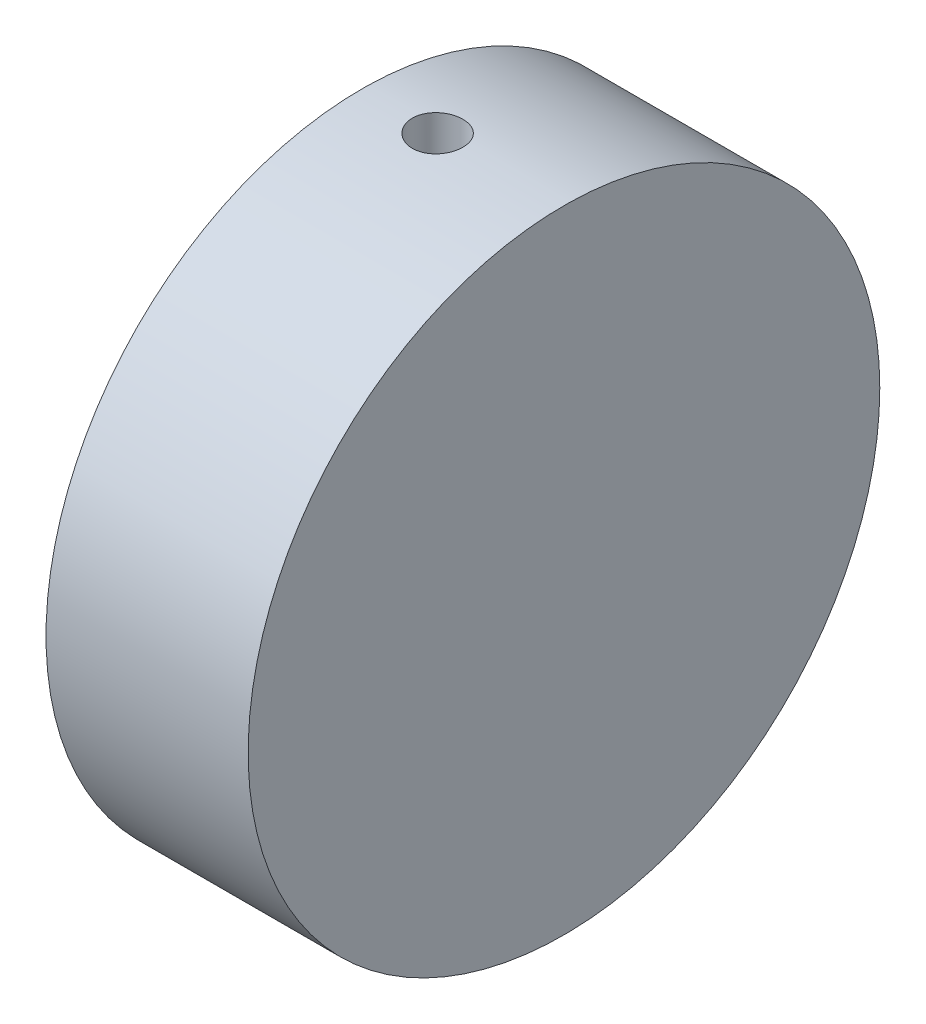
ISO-10303-21;
HEADER;
FILE_DESCRIPTION(('STEP AP214'),'2;1');
FILE_NAME('part.step','',(''),(''),'','','');
FILE_SCHEMA(('AUTOMOTIVE_DESIGN { 1 0 10303 214 1 1 1 1 }'));
ENDSEC;
DATA;
#1=APPLICATION_CONTEXT('core data for automotive mechanical design processes');
#2=APPLICATION_PROTOCOL_DEFINITION('international standard','automotive_design',2000,#1);
#3=PRODUCT_CONTEXT('',#1,'mechanical');
#4=PRODUCT('Part','Part','',(#3));
#5=PRODUCT_RELATED_PRODUCT_CATEGORY('part','',(#4));
#6=PRODUCT_DEFINITION_FORMATION('','',#4);
#7=PRODUCT_DEFINITION_CONTEXT('part definition',#1,'design');
#8=PRODUCT_DEFINITION('design','',#6,#7);
#9=PRODUCT_DEFINITION_SHAPE('','',#8);
#10=(LENGTH_UNIT() NAMED_UNIT(*) SI_UNIT(.MILLI.,.METRE.));
#11=(NAMED_UNIT(*) PLANE_ANGLE_UNIT() SI_UNIT($,.RADIAN.));
#12=(NAMED_UNIT(*) SI_UNIT($,.STERADIAN.) SOLID_ANGLE_UNIT());
#13=UNCERTAINTY_MEASURE_WITH_UNIT(LENGTH_MEASURE(1.E-05),#10,'distance_accuracy_value','');
#14=(GEOMETRIC_REPRESENTATION_CONTEXT(3) GLOBAL_UNCERTAINTY_ASSIGNED_CONTEXT((#13)) GLOBAL_UNIT_ASSIGNED_CONTEXT((#10,
#11,#12)) REPRESENTATION_CONTEXT('',''));
#15=CARTESIAN_POINT('',(0.,0.,0.));
#16=DIRECTION('',(0.,0.,1.));
#17=DIRECTION('',(1.,0.,0.));
#18=AXIS2_PLACEMENT_3D('',#15,#16,#17);
#19=CARTESIAN_POINT('',(8.,0.,0.));
#20=DIRECTION('',(-1.,0.,0.));
#21=DIRECTION('',(0.,0.,1.));
#22=AXIS2_PLACEMENT_3D('',#19,#20,#21);
#23=CYLINDRICAL_SURFACE('',#22,12.5);
#24=CARTESIAN_POINT('',(3.,-12.4599357943771,1.));
#25=CARTESIAN_POINT('',(2.94392607316291,-12.4599363261343,0.999997547085149));
#26=CARTESIAN_POINT('',(2.88781377680413,-12.4603183961439,0.99526770810122));
#27=CARTESIAN_POINT('',(2.77714117179239,-12.4618054137856,0.976468791829239));
#28=CARTESIAN_POINT('',(2.72258270410955,-12.4629111844775,0.962389080727772));
#29=CARTESIAN_POINT('',(2.61663672091101,-12.4657195634804,0.925299726825745));
#30=CARTESIAN_POINT('',(2.56524744854712,-12.4674218375571,0.902295084095044));
#31=CARTESIAN_POINT('',(2.46707214617231,-12.4712310003334,0.848017640285548));
#32=CARTESIAN_POINT('',(2.42028512254933,-12.4733378014056,0.816746629291101));
#33=CARTESIAN_POINT('',(2.33251879445891,-12.4777242610877,0.74674367887659));
#34=CARTESIAN_POINT('',(2.29155192791656,-12.4800042743739,0.707996166220319));
#35=CARTESIAN_POINT('',(2.21669560973395,-12.4844770022604,0.624172963840228));
#36=CARTESIAN_POINT('',(2.18280646475698,-12.4866697130747,0.579097000058929));
#37=CARTESIAN_POINT('',(2.12302661648495,-12.4907240968905,0.483822778983964));
#38=CARTESIAN_POINT('',(2.09714661268845,-12.4925853256653,0.433617787770056));
#39=CARTESIAN_POINT('',(2.05418812966838,-12.4957632239194,0.329557660725922));
#40=CARTESIAN_POINT('',(2.03710950713515,-12.4970799022654,0.275702584344853));
#41=CARTESIAN_POINT('',(2.01227421840224,-12.4990178703125,0.165994330507245));
#42=CARTESIAN_POINT('',(2.00449751047365,-12.4996406548649,0.110145716834905));
#43=CARTESIAN_POINT('',(1.99842485831795,-12.5001257253456,-0.00206734281681506));
#44=CARTESIAN_POINT('',(2.00012875020616,-12.4999880244198,-0.0584317798626918));
#45=CARTESIAN_POINT('',(2.01295251610763,-12.4989688748124,-0.169940639230495));
#46=CARTESIAN_POINT('',(2.02405083744425,-12.4980891285457,-0.225087557880391));
#47=CARTESIAN_POINT('',(2.05531492086009,-12.4956868144922,-0.332733300126542));
#48=CARTESIAN_POINT('',(2.07548076345706,-12.4941642409973,-0.385232100203441));
#49=CARTESIAN_POINT('',(2.12433154521446,-12.4906446582092,-0.486160050419075));
#50=CARTESIAN_POINT('',(2.15302615743627,-12.4886471107328,-0.534584499110233));
#51=CARTESIAN_POINT('',(2.21811291875467,-12.4844021206022,-0.625937836259755));
#52=CARTESIAN_POINT('',(2.25450521155147,-12.4821546732831,-0.668866622101123));
#53=CARTESIAN_POINT('',(2.33407580813115,-12.4776550925567,-0.748136019484698));
#54=CARTESIAN_POINT('',(2.37727283603389,-12.4754029636585,-0.784457838650308));
#55=CARTESIAN_POINT('',(2.46916138326791,-12.4711541938614,-0.849337126944275));
#56=CARTESIAN_POINT('',(2.51785290663021,-12.4691575531499,-0.877894590376294));
#57=CARTESIAN_POINT('',(2.61936124286225,-12.4656454222996,-0.926433699094362));
#58=CARTESIAN_POINT('',(2.67217850827158,-12.4641299850351,-0.94641440205707));
#59=CARTESIAN_POINT('',(2.78043289275428,-12.4617528334957,-0.977219066595045));
#60=CARTESIAN_POINT('',(2.8358699610992,-12.4608911065682,-0.988043205396475));
#61=CARTESIAN_POINT('',(2.94762594824767,-12.459920958717,-1.00020376185753));
#62=CARTESIAN_POINT('',(3.00394199981141,-12.4598104582821,-1.00156637071971));
#63=CARTESIAN_POINT('',(3.11600174736424,-12.4603497841393,-0.994833763901148));
#64=CARTESIAN_POINT('',(3.17174544826319,-12.4609996039037,-0.986738629421385));
#65=CARTESIAN_POINT('',(3.28100314734281,-12.4629844534383,-0.96134214776012));
#66=CARTESIAN_POINT('',(3.33451999786792,-12.4643185755325,-0.944052994644962));
#67=CARTESIAN_POINT('',(3.43789314942376,-12.4675209489402,-0.900771639268652));
#68=CARTESIAN_POINT('',(3.48774939624016,-12.4693892081624,-0.874779308143209));
#69=CARTESIAN_POINT('',(3.582506039642,-12.473454388194,-0.814763031379768));
#70=CARTESIAN_POINT('',(3.62739533990681,-12.4756520200531,-0.780721615210519));
#71=CARTESIAN_POINT('',(3.7108317652748,-12.4801259038523,-0.705598745600099));
#72=CARTESIAN_POINT('',(3.74937878969861,-12.4824021570399,-0.664517180422412));
#73=CARTESIAN_POINT('',(3.81912568833776,-12.4867829773348,-0.576367068175724));
#74=CARTESIAN_POINT('',(3.85030855768265,-12.4888871398827,-0.529285043502098));
#75=CARTESIAN_POINT('',(3.90432535994772,-12.4926808690718,-0.430537760510537));
#76=CARTESIAN_POINT('',(3.927159370658,-12.494370439576,-0.378872544901839));
#77=CARTESIAN_POINT('',(3.96380101032645,-12.4971427432508,-0.272486681653453));
#78=CARTESIAN_POINT('',(3.97761919882875,-12.4982261861197,-0.217769690191069));
#79=CARTESIAN_POINT('',(3.99587146668791,-12.4996670332512,-0.106783222479462));
#80=CARTESIAN_POINT('',(4.00030570836217,-12.5000244500722,-0.0505137731007016));
#81=CARTESIAN_POINT('',(3.99966238161324,-12.4999729971288,0.0618125911014058));
#82=CARTESIAN_POINT('',(3.99461133372156,-12.4995662638991,0.117869660706123));
#83=CARTESIAN_POINT('',(3.97519605689256,-12.4980364442858,0.22833669955051));
#84=CARTESIAN_POINT('',(3.96083181452032,-12.4969133568687,0.282746666414001));
#85=CARTESIAN_POINT('',(3.92320451741217,-12.4940768776102,0.388377092632294));
#86=CARTESIAN_POINT('',(3.8999418808362,-12.4923635135078,0.439597701732267));
#87=CARTESIAN_POINT('',(3.84518124768535,-12.4885382863701,0.537410622847658));
#88=CARTESIAN_POINT('',(3.81368339615536,-12.4864264303535,0.5840030163588));
#89=CARTESIAN_POINT('',(3.74324699857804,-12.4820343204354,0.671372532574256));
#90=CARTESIAN_POINT('',(3.70428887311469,-12.4797536333215,0.712133848623562));
#91=CARTESIAN_POINT('',(3.62007219477294,-12.4752845802424,0.786554832131109));
#92=CARTESIAN_POINT('',(3.57481211561389,-12.47309623681,0.820212774228543));
#93=CARTESIAN_POINT('',(3.47919503275548,-12.4690554560098,0.879513364136057));
#94=CARTESIAN_POINT('',(3.42882920875348,-12.4672036159134,0.905141817385163));
#95=CARTESIAN_POINT('',(3.3245292517866,-12.4640528500999,0.94754570133519));
#96=CARTESIAN_POINT('',(3.2705993163997,-12.4627532868983,0.964331344547328));
#97=CARTESIAN_POINT('',(3.18029086795884,-12.4611895849074,0.984282253054409));
#98=CARTESIAN_POINT('',(3.14449373236084,-12.4607215639363,0.990168611551805));
#99=CARTESIAN_POINT('',(3.07246974018599,-12.4600944971999,0.998028272959502));
#100=CARTESIAN_POINT('',(3.03624288465812,-12.4599354506806,1.00000158541973));
#101=CARTESIAN_POINT('',(3.,-12.4599357943771,1.));
#102=B_SPLINE_CURVE_WITH_KNOTS('',3,(#24,#25,#26,#27,#28,#29,#30,#31,#32,#33,#34,#35,#36,#37,
#38,#39,#40,#41,#42,#43,#44,#45,#46,#47,#48,#49,#50,#51,#52,#53,#54,#55,#56,#57,#58,#59,#60,#61,
#62,#63,#64,#65,#66,#67,#68,#69,#70,#71,#72,#73,#74,#75,#76,#77,#78,#79,#80,#81,#82,#83,#84,#85,
#86,#87,#88,#89,#90,#91,#92,#93,#94,#95,#96,#97,#98,#99,#100,#101),.UNSPECIFIED.,.T.,.F.,(4,2,2,
2,2,2,2,2,2,2,2,2,2,2,2,2,2,2,2,2,2,2,2,2,2,2,2,2,2,2,2,2,2,2,2,2,2,2,4),(0.,0.16808945469194,
0.336370409349233,0.504557222747153,0.672707645037223,0.84121217411268,1.00972400263285,
1.178459985731,1.34719322127611,1.51556224873124,1.68392836571454,1.85190926120529,
2.01989164836149,2.18806528760008,2.35624206657957,2.52488996039299,2.693537977935,
2.86220451999013,3.03086779741371,3.19906399800308,3.36725875452733,3.53523098797079,
3.70320570861836,3.87154842028779,4.03989380402717,4.2086242008813,4.37735302555795,
4.5458838746034,4.71441180848818,4.88246924571035,5.05052692536746,5.2185767085033,
5.38662353201744,5.55511759193959,5.72365253093073,5.89248374712536,6.06111955127102,
6.16976294277555,6.2784060691317),.UNSPECIFIED.);
#103=CARTESIAN_POINT('',(3.,-12.4599357943771,1.));
#104=VERTEX_POINT('',#103);
#105=EDGE_CURVE('E50',#104,#104,#102,.T.);
#106=ORIENTED_EDGE('',*,*,#105,.F.);
#107=EDGE_LOOP('',(#106));
#108=FACE_BOUND('',#107,.T.);
#109=CARTESIAN_POINT('',(8.,0.,0.));
#110=DIRECTION('',(1.,0.,0.));
#111=DIRECTION('',(0.,0.,-1.));
#112=AXIS2_PLACEMENT_3D('',#109,#110,#111);
#113=CIRCLE('',#112,12.5);
#114=CARTESIAN_POINT('',(8.,0.,-12.5));
#115=VERTEX_POINT('',#114);
#116=EDGE_CURVE('E10',#115,#115,#113,.T.);
#117=ORIENTED_EDGE('',*,*,#116,.F.);
#118=EDGE_LOOP('',(#117));
#119=FACE_BOUND('',#118,.T.);
#120=CARTESIAN_POINT('',(0.,0.,0.));
#121=DIRECTION('',(1.,0.,0.));
#122=DIRECTION('',(0.,0.,-1.));
#123=AXIS2_PLACEMENT_3D('',#120,#121,#122);
#124=CIRCLE('',#123,12.5);
#125=CARTESIAN_POINT('',(0.,0.,-12.5));
#126=VERTEX_POINT('',#125);
#127=EDGE_CURVE('E35',#126,#126,#124,.T.);
#128=ORIENTED_EDGE('',*,*,#127,.T.);
#129=EDGE_LOOP('',(#128));
#130=FACE_BOUND('',#129,.T.);
#131=CARTESIAN_POINT('',(3.,12.4599357943771,-1.));
#132=CARTESIAN_POINT('',(3.05607392683709,12.4599363261343,-0.999997547085149));
#133=CARTESIAN_POINT('',(3.11218622319587,12.4603183961439,-0.99526770810122));
#134=CARTESIAN_POINT('',(3.22285882820761,12.4618054137856,-0.976468791829239));
#135=CARTESIAN_POINT('',(3.27741729589045,12.4629111844775,-0.962389080727772));
#136=CARTESIAN_POINT('',(3.38336327908899,12.4657195634804,-0.925299726825745));
#137=CARTESIAN_POINT('',(3.43475255145288,12.4674218375571,-0.902295084095044));
#138=CARTESIAN_POINT('',(3.53292785382769,12.4712310003334,-0.848017640285549));
#139=CARTESIAN_POINT('',(3.57971487745067,12.4733378014056,-0.816746629291101));
#140=CARTESIAN_POINT('',(3.66748120554109,12.4777242610877,-0.74674367887659));
#141=CARTESIAN_POINT('',(3.70844807208344,12.4800042743739,-0.707996166220319));
#142=CARTESIAN_POINT('',(3.78330439026605,12.4844770022604,-0.624172963840228));
#143=CARTESIAN_POINT('',(3.81719353524302,12.4866697130747,-0.579097000058929));
#144=CARTESIAN_POINT('',(3.87697338351505,12.4907240968905,-0.483822778983964));
#145=CARTESIAN_POINT('',(3.90285338731155,12.4925853256653,-0.433617787770057));
#146=CARTESIAN_POINT('',(3.94581187033162,12.4957632239194,-0.329557660725923));
#147=CARTESIAN_POINT('',(3.96289049286485,12.4970799022654,-0.275702584344854));
#148=CARTESIAN_POINT('',(3.98772578159776,12.4990178703125,-0.165994330507245));
#149=CARTESIAN_POINT('',(3.99550248952635,12.4996406548649,-0.110145716834905));
#150=CARTESIAN_POINT('',(4.00157514168205,12.5001257253456,0.00206734281681487));
#151=CARTESIAN_POINT('',(3.99987124979384,12.4999880244198,0.0584317798626918));
#152=CARTESIAN_POINT('',(3.98704748389237,12.4989688748124,0.169940639230495));
#153=CARTESIAN_POINT('',(3.97594916255575,12.4980891285457,0.225087557880392));
#154=CARTESIAN_POINT('',(3.94468507913991,12.4956868144922,0.332733300126542));
#155=CARTESIAN_POINT('',(3.92451923654294,12.4941642409973,0.385232100203441));
#156=CARTESIAN_POINT('',(3.87566845478554,12.4906446582092,0.486160050419075));
#157=CARTESIAN_POINT('',(3.84697384256373,12.4886471107328,0.534584499110233));
#158=CARTESIAN_POINT('',(3.78188708124533,12.4844021206022,0.625937836259755));
#159=CARTESIAN_POINT('',(3.74549478844853,12.4821546732831,0.668866622101123));
#160=CARTESIAN_POINT('',(3.66592419186885,12.4776550925567,0.748136019484699));
#161=CARTESIAN_POINT('',(3.62272716396611,12.4754029636585,0.784457838650308));
#162=CARTESIAN_POINT('',(3.53083861673209,12.4711541938614,0.849337126944275));
#163=CARTESIAN_POINT('',(3.48214709336979,12.4691575531499,0.877894590376294));
#164=CARTESIAN_POINT('',(3.38063875713775,12.4656454222996,0.926433699094362));
#165=CARTESIAN_POINT('',(3.32782149172842,12.4641299850351,0.94641440205707));
#166=CARTESIAN_POINT('',(3.21956710724572,12.4617528334957,0.977219066595045));
#167=CARTESIAN_POINT('',(3.1641300389008,12.4608911065682,0.988043205396475));
#168=CARTESIAN_POINT('',(3.05237405175233,12.459920958717,1.00020376185753));
#169=CARTESIAN_POINT('',(2.99605800018859,12.4598104582821,1.00156637071971));
#170=CARTESIAN_POINT('',(2.88399825263576,12.4603497841393,0.994833763901148));
#171=CARTESIAN_POINT('',(2.82825455173681,12.4609996039037,0.986738629421385));
#172=CARTESIAN_POINT('',(2.71899685265719,12.4629844534383,0.96134214776012));
#173=CARTESIAN_POINT('',(2.66548000213208,12.4643185755325,0.944052994644962));
#174=CARTESIAN_POINT('',(2.56210685057624,12.4675209489402,0.900771639268652));
#175=CARTESIAN_POINT('',(2.51225060375984,12.4693892081624,0.874779308143209));
#176=CARTESIAN_POINT('',(2.417493960358,12.473454388194,0.814763031379768));
#177=CARTESIAN_POINT('',(2.37260466009319,12.4756520200531,0.780721615210519));
#178=CARTESIAN_POINT('',(2.2891682347252,12.4801259038523,0.705598745600099));
#179=CARTESIAN_POINT('',(2.25062121030139,12.4824021570399,0.664517180422412));
#180=CARTESIAN_POINT('',(2.18087431166224,12.4867829773348,0.576367068175724));
#181=CARTESIAN_POINT('',(2.14969144231735,12.4888871398827,0.529285043502097));
#182=CARTESIAN_POINT('',(2.09567464005228,12.4926808690718,0.430537760510537));
#183=CARTESIAN_POINT('',(2.07284062934201,12.494370439576,0.378872544901839));
#184=CARTESIAN_POINT('',(2.03619898967355,12.4971427432508,0.272486681653452));
#185=CARTESIAN_POINT('',(2.02238080117125,12.4982261861197,0.217769690191068));
#186=CARTESIAN_POINT('',(2.00412853331209,12.4996670332512,0.106783222479462));
#187=CARTESIAN_POINT('',(1.99969429163783,12.5000244500722,0.0505137731007014));
#188=CARTESIAN_POINT('',(2.00033761838676,12.4999729971288,-0.061812591101406));
#189=CARTESIAN_POINT('',(2.00538866627844,12.4995662638991,-0.117869660706124));
#190=CARTESIAN_POINT('',(2.02480394310744,12.4980364442858,-0.22833669955051));
#191=CARTESIAN_POINT('',(2.03916818547968,12.4969133568687,-0.282746666414001));
#192=CARTESIAN_POINT('',(2.07679548258783,12.4940768776102,-0.388377092632294));
#193=CARTESIAN_POINT('',(2.1000581191638,12.4923635135078,-0.439597701732267));
#194=CARTESIAN_POINT('',(2.15481875231465,12.4885382863701,-0.537410622847658));
#195=CARTESIAN_POINT('',(2.18631660384464,12.4864264303535,-0.5840030163588));
#196=CARTESIAN_POINT('',(2.25675300142196,12.4820343204354,-0.671372532574257));
#197=CARTESIAN_POINT('',(2.29571112688531,12.4797536333215,-0.712133848623562));
#198=CARTESIAN_POINT('',(2.37992780522706,12.4752845802424,-0.786554832131109));
#199=CARTESIAN_POINT('',(2.42518788438611,12.47309623681,-0.820212774228543));
#200=CARTESIAN_POINT('',(2.52080496724452,12.4690554560098,-0.879513364136057));
#201=CARTESIAN_POINT('',(2.57117079124652,12.4672036159134,-0.905141817385163));
#202=CARTESIAN_POINT('',(2.6754707482134,12.4640528500999,-0.94754570133519));
#203=CARTESIAN_POINT('',(2.7294006836003,12.4627532868983,-0.964331344547328));
#204=CARTESIAN_POINT('',(2.81970913204116,12.4611895849074,-0.984282253054409));
#205=CARTESIAN_POINT('',(2.85550626763916,12.4607215639363,-0.990168611551805));
#206=CARTESIAN_POINT('',(2.92753025981401,12.4600944971999,-0.998028272959502));
#207=CARTESIAN_POINT('',(2.96375711534188,12.4599354506806,-1.00000158541973));
#208=CARTESIAN_POINT('',(3.,12.4599357943771,-1.));
#209=B_SPLINE_CURVE_WITH_KNOTS('',3,(#131,#132,#133,#134,#135,#136,#137,#138,#139,#140,#141,
#142,#143,#144,#145,#146,#147,#148,#149,#150,#151,#152,#153,#154,#155,#156,#157,#158,#159,#160,
#161,#162,#163,#164,#165,#166,#167,#168,#169,#170,#171,#172,#173,#174,#175,#176,#177,#178,#179,
#180,#181,#182,#183,#184,#185,#186,#187,#188,#189,#190,#191,#192,#193,#194,#195,#196,#197,#198,
#199,#200,#201,#202,#203,#204,#205,#206,#207,#208),.UNSPECIFIED.,.T.,.F.,(4,2,2,2,2,2,2,2,2,2,2,
2,2,2,2,2,2,2,2,2,2,2,2,2,2,2,2,2,2,2,2,2,2,2,2,2,2,2,4),(0.,0.16808945469194,0.336370409349233,
0.504557222747152,0.672707645037223,0.84121217411268,1.00972400263285,1.178459985731,
1.34719322127611,1.51556224873124,1.68392836571454,1.85190926120529,2.01989164836149,
2.18806528760008,2.35624206657957,2.52488996039299,2.693537977935,2.86220451999013,
3.03086779741371,3.19906399800308,3.36725875452733,3.53523098797079,3.70320570861836,
3.87154842028779,4.03989380402717,4.2086242008813,4.37735302555795,4.5458838746034,
4.71441180848818,4.88246924571035,5.05052692536746,5.2185767085033,5.38662353201744,
5.55511759193959,5.72365253093073,5.89248374712536,6.06111955127102,6.16976294277555,
6.2784060691317),.UNSPECIFIED.);
#210=CARTESIAN_POINT('',(3.,12.4599357943771,-1.));
#211=VERTEX_POINT('',#210);
#212=EDGE_CURVE('E47',#211,#211,#209,.T.);
#213=ORIENTED_EDGE('',*,*,#212,.T.);
#214=EDGE_LOOP('',(#213));
#215=FACE_BOUND('',#214,.T.);
#216=ADVANCED_FACE('F32',(#108,#119,#130,#215),#23,.T.);
#217=CARTESIAN_POINT('',(6.,0.,0.));
#218=DIRECTION('',(-1.,0.,0.));
#219=DIRECTION('',(0.,0.,1.));
#220=AXIS2_PLACEMENT_3D('',#217,#218,#219);
#221=CYLINDRICAL_SURFACE('',#220,3.2);
#222=CARTESIAN_POINT('',(3.,-3.03973683071413,1.));
#223=CARTESIAN_POINT('',(3.05467762887039,-3.0397371679444,0.99999963024345));
#224=CARTESIAN_POINT('',(3.10935901491222,-3.0412282529855,0.995500310344962));
#225=CARTESIAN_POINT('',(3.21711532865582,-3.04700511293903,0.977673403223082));
#226=CARTESIAN_POINT('',(3.27018981817649,-3.05129164307935,0.964343430262027));
#227=CARTESIAN_POINT('',(3.37315592156192,-3.06212751043461,0.929358305784155));
#228=CARTESIAN_POINT('',(3.42305298648892,-3.06867284148665,0.907717885892257));
#229=CARTESIAN_POINT('',(3.51852215668683,-3.0832832498174,0.856775313386413));
#230=CARTESIAN_POINT('',(3.56409349596691,-3.09134859550518,0.82747180724537));
#231=CARTESIAN_POINT('',(3.65118309399602,-3.10840102132993,0.760956856497509));
#232=CARTESIAN_POINT('',(3.69253088754912,-3.11740898707314,0.723527519776231));
#233=CARTESIAN_POINT('',(3.76847681056702,-3.13515396688779,0.642289637164482));
#234=CARTESIAN_POINT('',(3.80307399755579,-3.1438909429824,0.598480202014875));
#235=CARTESIAN_POINT('',(3.86528885040909,-3.16034842711921,0.504500729994665));
#236=CARTESIAN_POINT('',(3.89273096306519,-3.16804147650186,0.454209245216069));
#237=CARTESIAN_POINT('',(3.93870083988441,-3.18130041466453,0.349443386282729));
#238=CARTESIAN_POINT('',(3.95723069931966,-3.18686680335945,0.294969998789643));
#239=CARTESIAN_POINT('',(3.98428090247766,-3.1950974065668,0.185171485572876));
#240=CARTESIAN_POINT('',(3.99309259983028,-3.19784591187312,0.129924572374571));
#241=CARTESIAN_POINT('',(4.00137947715002,-3.20042876700814,0.0186726511876164));
#242=CARTESIAN_POINT('',(4.00085677948706,-3.20026377928052,-0.0373321815784669));
#243=CARTESIAN_POINT('',(3.99068136673124,-3.1970969290603,-0.146459584283788));
#244=CARTESIAN_POINT('',(3.98134449318958,-3.19419320777728,-0.199614907451236));
#245=CARTESIAN_POINT('',(3.9543240079656,-3.18599586048681,-0.303562450678217));
#246=CARTESIAN_POINT('',(3.93663985193076,-3.18070207861698,-0.354354516384957));
#247=CARTESIAN_POINT('',(3.89322384874009,-3.16818767783636,-0.452862482523825));
#248=CARTESIAN_POINT('',(3.86739615314957,-3.16094426893602,-0.500533124498266));
#249=CARTESIAN_POINT('',(3.80850312023636,-3.14529378362813,-0.590962008921623));
#250=CARTESIAN_POINT('',(3.77543595268975,-3.13688641315531,-0.633719004967068));
#251=CARTESIAN_POINT('',(3.70138109215895,-3.11938936587859,-0.714990158763107));
#252=CARTESIAN_POINT('',(3.66012074492698,-3.11028585591808,-0.75325323927535));
#253=CARTESIAN_POINT('',(3.57168391854049,-3.09272492351789,-0.822391794076293));
#254=CARTESIAN_POINT('',(3.52450674354023,-3.08426757725855,-0.853266398202702));
#255=CARTESIAN_POINT('',(3.42486602491189,-3.06888677321224,-0.907043720158153));
#256=CARTESIAN_POINT('',(3.37234927276522,-3.06198152291129,-0.929853445621562));
#257=CARTESIAN_POINT('',(3.26395240648459,-3.05070036263463,-0.966226767588001));
#258=CARTESIAN_POINT('',(3.20807350863485,-3.04632354398012,-0.979793686125952));
#259=CARTESIAN_POINT('',(3.09694403795316,-3.04079650741015,-0.996811881484679));
#260=CARTESIAN_POINT('',(3.04175840302105,-3.03952373212419,-1.00064763482981));
#261=CARTESIAN_POINT('',(2.93152820680351,-3.04000862071333,-0.999173955986524));
#262=CARTESIAN_POINT('',(2.87648362503608,-3.04176581633218,-0.993865936890527));
#263=CARTESIAN_POINT('',(2.76975336267354,-3.0479916596061,-0.974598988104683));
#264=CARTESIAN_POINT('',(2.71801658073943,-3.05238043274495,-0.960894649284177));
#265=CARTESIAN_POINT('',(2.61758256640454,-3.0632902987222,-0.925522989288344));
#266=CARTESIAN_POINT('',(2.56888583126342,-3.06981173931781,-0.90385436936927));
#267=CARTESIAN_POINT('',(2.47436871218222,-3.084484317206,-0.852460085246963));
#268=CARTESIAN_POINT('',(2.42867086752568,-3.0926768279127,-0.822521179908449));
#269=CARTESIAN_POINT('',(2.34280772291057,-3.10968279178779,-0.755685126943858));
#270=CARTESIAN_POINT('',(2.30264386485976,-3.11849640588703,-0.718786171752629));
#271=CARTESIAN_POINT('',(2.22727170726972,-3.13619350049997,-0.637258358202881));
#272=CARTESIAN_POINT('',(2.1923377710881,-3.14506473828504,-0.592372519830816));
#273=CARTESIAN_POINT('',(2.130487165343,-3.16151247874982,-0.497161236521119));
#274=CARTESIAN_POINT('',(2.10357012855117,-3.16908904072767,-0.446836040886898));
#275=CARTESIAN_POINT('',(2.05877555002265,-3.18205049542799,-0.342484418665465));
#276=CARTESIAN_POINT('',(2.04083256972505,-3.18745119648957,-0.288488147427004));
#277=CARTESIAN_POINT('',(2.01434196912824,-3.19552194118864,-0.178045803245111));
#278=CARTESIAN_POINT('',(2.0057914087332,-3.19819283931423,-0.121600502672285));
#279=CARTESIAN_POINT('',(1.9985671986003,-3.20044642723569,-0.0103879493191192));
#280=CARTESIAN_POINT('',(1.99949723986339,-3.20015303525912,0.0443513535572176));
#281=CARTESIAN_POINT('',(2.01024944883896,-3.19680782464839,0.152858577538598));
#282=CARTESIAN_POINT('',(2.02007103679356,-3.19375618586094,0.206626561743654));
#283=CARTESIAN_POINT('',(2.04807520737782,-3.18527656675837,0.311004094784633));
#284=CARTESIAN_POINT('',(2.0661516862763,-3.17987878368167,0.361644734759585));
#285=CARTESIAN_POINT('',(2.11005666176678,-3.16726356470358,0.459198740400073));
#286=CARTESIAN_POINT('',(2.13588648797875,-3.16004581673077,0.506111465019584));
#287=CARTESIAN_POINT('',(2.19557820667555,-3.1442391750671,0.596609355975752));
#288=CARTESIAN_POINT('',(2.22968281797116,-3.13561207800806,0.640027685642493));
#289=CARTESIAN_POINT('',(2.30452791155478,-3.11806989237613,0.720656633119451));
#290=CARTESIAN_POINT('',(2.34527037931156,-3.10915471827727,0.757865386803311));
#291=CARTESIAN_POINT('',(2.43385257587283,-3.09169514062089,0.826262927290038));
#292=CARTESIAN_POINT('',(2.48188272249307,-3.08317280691291,0.857211423957753));
#293=CARTESIAN_POINT('',(2.5827184962155,-3.06784100223099,0.910563765988107));
#294=CARTESIAN_POINT('',(2.63552218116091,-3.06103083887145,0.932971067228124));
#295=CARTESIAN_POINT('',(2.73977809385109,-3.05045248354059,0.96696944348656));
#296=CARTESIAN_POINT('',(2.79096203795892,-3.04647452041439,0.979319518703782));
#297=CARTESIAN_POINT('',(2.89476306567952,-3.04111685179481,0.995833966528002));
#298=CARTESIAN_POINT('',(2.94737979296986,-3.03973650617324,1.00000035584327));
#299=CARTESIAN_POINT('',(3.,-3.03973683071413,1.));
#300=B_SPLINE_CURVE_WITH_KNOTS('',3,(#222,#223,#224,#225,#226,#227,#228,#229,#230,#231,#232,
#233,#234,#235,#236,#237,#238,#239,#240,#241,#242,#243,#244,#245,#246,#247,#248,#249,#250,#251,
#252,#253,#254,#255,#256,#257,#258,#259,#260,#261,#262,#263,#264,#265,#266,#267,#268,#269,#270,
#271,#272,#273,#274,#275,#276,#277,#278,#279,#280,#281,#282,#283,#284,#285,#286,#287,#288,#289,
#290,#291,#292,#293,#294,#295,#296,#297,#298,#299),.UNSPECIFIED.,.T.,.F.,(4,2,2,2,2,2,2,2,2,2,2,
2,2,2,2,2,2,2,2,2,2,2,2,2,2,2,2,2,2,2,2,2,2,2,2,2,2,2,4),(0.,0.163838510014586,
0.327721301600959,0.491314915248035,0.654937443893129,0.823656644359877,0.992399383482153,
1.16495857566304,1.33747717929655,1.50466978263744,1.67182437172737,1.83320786371118,
1.99460188147392,2.15797123682044,2.32138194165867,2.49160271145184,2.66184351878338,
2.8339877674288,3.00607011157519,3.17123946622954,3.33638329765181,3.496751776254,
3.65714641792478,3.82214090637598,3.98717830399414,4.15905550239119,4.33092482643579,
4.50152191422708,4.67206558502378,4.8355104194153,4.99894459743755,5.16033477201717,
5.32175263919231,5.48864554474082,5.65558846207662,5.82806236391274,6.00046640632968,
6.15817883487019,6.31585239340933),.UNSPECIFIED.);
#301=CARTESIAN_POINT('',(3.,-3.03973683071413,1.));
#302=VERTEX_POINT('',#301);
#303=EDGE_CURVE('E59',#302,#302,#300,.T.);
#304=ORIENTED_EDGE('',*,*,#303,.F.);
#305=EDGE_LOOP('',(#304));
#306=FACE_BOUND('',#305,.T.);
#307=CARTESIAN_POINT('',(6.,0.,0.));
#308=DIRECTION('',(-1.,0.,0.));
#309=DIRECTION('',(0.,0.,1.));
#310=AXIS2_PLACEMENT_3D('',#307,#308,#309);
#311=CIRCLE('',#310,3.2);
#312=CARTESIAN_POINT('',(6.,0.,3.2));
#313=VERTEX_POINT('',#312);
#314=EDGE_CURVE('E42',#313,#313,#311,.T.);
#315=ORIENTED_EDGE('',*,*,#314,.F.);
#316=EDGE_LOOP('',(#315));
#317=FACE_BOUND('',#316,.T.);
#318=CARTESIAN_POINT('',(0.,0.,0.));
#319=DIRECTION('',(-1.,0.,0.));
#320=DIRECTION('',(0.,0.,1.));
#321=AXIS2_PLACEMENT_3D('',#318,#319,#320);
#322=CIRCLE('',#321,3.2);
#323=CARTESIAN_POINT('',(0.,0.,3.2));
#324=VERTEX_POINT('',#323);
#325=EDGE_CURVE('E44',#324,#324,#322,.T.);
#326=ORIENTED_EDGE('',*,*,#325,.T.);
#327=EDGE_LOOP('',(#326));
#328=FACE_BOUND('',#327,.T.);
#329=CARTESIAN_POINT('',(3.,3.03973683071413,-1.));
#330=CARTESIAN_POINT('',(2.94532237112961,3.0397371679444,-0.99999963024345));
#331=CARTESIAN_POINT('',(2.89064098508778,3.0412282529855,-0.995500310344962));
#332=CARTESIAN_POINT('',(2.78288467134418,3.04700511293903,-0.977673403223082));
#333=CARTESIAN_POINT('',(2.72981018182351,3.05129164307935,-0.964343430262026));
#334=CARTESIAN_POINT('',(2.62684407843808,3.06212751043461,-0.929358305784155));
#335=CARTESIAN_POINT('',(2.57694701351108,3.06867284148665,-0.907717885892257));
#336=CARTESIAN_POINT('',(2.48147784331317,3.0832832498174,-0.856775313386413));
#337=CARTESIAN_POINT('',(2.43590650403309,3.09134859550518,-0.827471807245369));
#338=CARTESIAN_POINT('',(2.34881690600398,3.10840102132993,-0.760956856497509));
#339=CARTESIAN_POINT('',(2.30746911245088,3.11740898707314,-0.723527519776231));
#340=CARTESIAN_POINT('',(2.23152318943298,3.13515396688779,-0.642289637164482));
#341=CARTESIAN_POINT('',(2.19692600244421,3.1438909429824,-0.598480202014875));
#342=CARTESIAN_POINT('',(2.13471114959091,3.16034842711921,-0.504500729994665));
#343=CARTESIAN_POINT('',(2.10726903693481,3.16804147650186,-0.454209245216069));
#344=CARTESIAN_POINT('',(2.06129916011558,3.18130041466453,-0.349443386282729));
#345=CARTESIAN_POINT('',(2.04276930068034,3.18686680335945,-0.294969998789643));
#346=CARTESIAN_POINT('',(2.01571909752234,3.1950974065668,-0.185171485572876));
#347=CARTESIAN_POINT('',(2.00690740016972,3.19784591187312,-0.129924572374572));
#348=CARTESIAN_POINT('',(1.99862052284998,3.20042876700814,-0.0186726511876166));
#349=CARTESIAN_POINT('',(1.99914322051294,3.20026377928052,0.0373321815784667));
#350=CARTESIAN_POINT('',(2.00931863326876,3.1970969290603,0.146459584283788));
#351=CARTESIAN_POINT('',(2.01865550681042,3.19419320777728,0.199614907451235));
#352=CARTESIAN_POINT('',(2.0456759920344,3.18599586048681,0.303562450678216));
#353=CARTESIAN_POINT('',(2.06336014806924,3.18070207861698,0.354354516384956));
#354=CARTESIAN_POINT('',(2.10677615125991,3.16818767783636,0.452862482523825));
#355=CARTESIAN_POINT('',(2.13260384685043,3.16094426893602,0.500533124498265));
#356=CARTESIAN_POINT('',(2.19149687976364,3.14529378362813,0.590962008921623));
#357=CARTESIAN_POINT('',(2.22456404731025,3.13688641315531,0.633719004967068));
#358=CARTESIAN_POINT('',(2.29861890784105,3.11938936587859,0.714990158763107));
#359=CARTESIAN_POINT('',(2.33987925507302,3.11028585591808,0.75325323927535));
#360=CARTESIAN_POINT('',(2.42831608145951,3.09272492351789,0.822391794076293));
#361=CARTESIAN_POINT('',(2.47549325645977,3.08426757725855,0.853266398202702));
#362=CARTESIAN_POINT('',(2.57513397508811,3.06888677321224,0.907043720158153));
#363=CARTESIAN_POINT('',(2.62765072723478,3.06198152291129,0.929853445621562));
#364=CARTESIAN_POINT('',(2.73604759351541,3.05070036263463,0.966226767588001));
#365=CARTESIAN_POINT('',(2.79192649136515,3.04632354398012,0.979793686125952));
#366=CARTESIAN_POINT('',(2.90305596204684,3.04079650741015,0.996811881484679));
#367=CARTESIAN_POINT('',(2.95824159697895,3.03952373212419,1.00064763482981));
#368=CARTESIAN_POINT('',(3.06847179319649,3.04000862071333,0.999173955986524));
#369=CARTESIAN_POINT('',(3.12351637496392,3.04176581633218,0.993865936890527));
#370=CARTESIAN_POINT('',(3.23024663732646,3.0479916596061,0.974598988104683));
#371=CARTESIAN_POINT('',(3.28198341926057,3.05238043274495,0.960894649284177));
#372=CARTESIAN_POINT('',(3.38241743359546,3.0632902987222,0.925522989288344));
#373=CARTESIAN_POINT('',(3.43111416873658,3.06981173931781,0.90385436936927));
#374=CARTESIAN_POINT('',(3.52563128781778,3.084484317206,0.852460085246963));
#375=CARTESIAN_POINT('',(3.57132913247432,3.0926768279127,0.822521179908449));
#376=CARTESIAN_POINT('',(3.65719227708943,3.10968279178779,0.755685126943858));
#377=CARTESIAN_POINT('',(3.69735613514024,3.11849640588703,0.718786171752629));
#378=CARTESIAN_POINT('',(3.77272829273028,3.13619350049997,0.637258358202881));
#379=CARTESIAN_POINT('',(3.8076622289119,3.14506473828504,0.592372519830816));
#380=CARTESIAN_POINT('',(3.869512834657,3.16151247874982,0.497161236521119));
#381=CARTESIAN_POINT('',(3.89642987144883,3.16908904072767,0.446836040886898));
#382=CARTESIAN_POINT('',(3.94122444997735,3.18205049542799,0.342484418665465));
#383=CARTESIAN_POINT('',(3.95916743027495,3.18745119648957,0.288488147427004));
#384=CARTESIAN_POINT('',(3.98565803087177,3.19552194118864,0.178045803245112));
#385=CARTESIAN_POINT('',(3.9942085912668,3.19819283931423,0.121600502672285));
#386=CARTESIAN_POINT('',(4.0014328013997,3.20044642723569,0.0103879493191189));
#387=CARTESIAN_POINT('',(4.00050276013661,3.20015303525912,-0.0443513535572179));
#388=CARTESIAN_POINT('',(3.98975055116104,3.19680782464839,-0.152858577538598));
#389=CARTESIAN_POINT('',(3.97992896320644,3.19375618586094,-0.206626561743655));
#390=CARTESIAN_POINT('',(3.95192479262218,3.18527656675837,-0.311004094784633));
#391=CARTESIAN_POINT('',(3.9338483137237,3.17987878368167,-0.361644734759584));
#392=CARTESIAN_POINT('',(3.88994333823322,3.16726356470358,-0.459198740400072));
#393=CARTESIAN_POINT('',(3.86411351202125,3.16004581673077,-0.506111465019584));
#394=CARTESIAN_POINT('',(3.80442179332445,3.1442391750671,-0.596609355975752));
#395=CARTESIAN_POINT('',(3.77031718202884,3.13561207800806,-0.640027685642493));
#396=CARTESIAN_POINT('',(3.69547208844522,3.11806989237613,-0.72065663311945));
#397=CARTESIAN_POINT('',(3.65472962068844,3.10915471827727,-0.757865386803311));
#398=CARTESIAN_POINT('',(3.56614742412717,3.09169514062089,-0.826262927290038));
#399=CARTESIAN_POINT('',(3.51811727750693,3.08317280691291,-0.857211423957753));
#400=CARTESIAN_POINT('',(3.4172815037845,3.06784100223099,-0.910563765988108));
#401=CARTESIAN_POINT('',(3.36447781883909,3.06103083887145,-0.932971067228124));
#402=CARTESIAN_POINT('',(3.26022190614891,3.05045248354059,-0.96696944348656));
#403=CARTESIAN_POINT('',(3.20903796204108,3.04647452041439,-0.979319518703781));
#404=CARTESIAN_POINT('',(3.10523693432048,3.0411168517948,-0.995833966528002));
#405=CARTESIAN_POINT('',(3.05262020703014,3.03973650617324,-1.00000035584327));
#406=CARTESIAN_POINT('',(3.,3.03973683071413,-1.));
#407=B_SPLINE_CURVE_WITH_KNOTS('',3,(#329,#330,#331,#332,#333,#334,#335,#336,#337,#338,#339,
#340,#341,#342,#343,#344,#345,#346,#347,#348,#349,#350,#351,#352,#353,#354,#355,#356,#357,#358,
#359,#360,#361,#362,#363,#364,#365,#366,#367,#368,#369,#370,#371,#372,#373,#374,#375,#376,#377,
#378,#379,#380,#381,#382,#383,#384,#385,#386,#387,#388,#389,#390,#391,#392,#393,#394,#395,#396,
#397,#398,#399,#400,#401,#402,#403,#404,#405,#406),.UNSPECIFIED.,.T.,.F.,(4,2,2,2,2,2,2,2,2,2,2,
2,2,2,2,2,2,2,2,2,2,2,2,2,2,2,2,2,2,2,2,2,2,2,2,2,2,2,4),(0.,0.163838510014587,
0.327721301600959,0.491314915248036,0.654937443893129,0.823656644359877,0.992399383482153,
1.16495857566304,1.33747717929655,1.50466978263744,1.67182437172737,1.83320786371117,
1.99460188147392,2.15797123682044,2.32138194165867,2.49160271145184,2.66184351878338,
2.8339877674288,3.00607011157519,3.17123946622954,3.33638329765181,3.496751776254,
3.65714641792478,3.82214090637598,3.98717830399414,4.15905550239119,4.33092482643579,
4.50152191422708,4.67206558502378,4.8355104194153,4.99894459743755,5.16033477201717,
5.32175263919231,5.48864554474082,5.65558846207662,5.82806236391273,6.00046640632967,
6.15817883487019,6.31585239340933),.UNSPECIFIED.);
#408=CARTESIAN_POINT('',(3.,3.03973683071413,-1.));
#409=VERTEX_POINT('',#408);
#410=EDGE_CURVE('E58',#409,#409,#407,.T.);
#411=ORIENTED_EDGE('',*,*,#410,.T.);
#412=EDGE_LOOP('',(#411));
#413=FACE_BOUND('',#412,.T.);
#414=ADVANCED_FACE('F92',(#306,#317,#328,#413),#221,.F.);
#415=CARTESIAN_POINT('',(8.,0.,0.));
#416=DIRECTION('',(1.,0.,0.));
#417=DIRECTION('',(0.,0.,-1.));
#418=AXIS2_PLACEMENT_3D('',#415,#416,#417);
#419=PLANE('',#418);
#420=ORIENTED_EDGE('',*,*,#116,.T.);
#421=EDGE_LOOP('',(#420));
#422=FACE_BOUND('',#421,.T.);
#423=ADVANCED_FACE('F95',(#422),#419,.T.);
#424=CARTESIAN_POINT('',(0.,0.,0.));
#425=DIRECTION('',(1.,0.,0.));
#426=DIRECTION('',(0.,0.,-1.));
#427=AXIS2_PLACEMENT_3D('',#424,#425,#426);
#428=PLANE('',#427);
#429=ORIENTED_EDGE('',*,*,#325,.F.);
#430=EDGE_LOOP('',(#429));
#431=FACE_BOUND('',#430,.T.);
#432=ORIENTED_EDGE('',*,*,#127,.F.);
#433=EDGE_LOOP('',(#432));
#434=FACE_BOUND('',#433,.T.);
#435=ADVANCED_FACE('F103',(#431,#434),#428,.F.);
#436=CARTESIAN_POINT('',(6.,0.,0.));
#437=DIRECTION('',(-1.,0.,0.));
#438=DIRECTION('',(0.,0.,1.));
#439=AXIS2_PLACEMENT_3D('',#436,#437,#438);
#440=PLANE('',#439);
#441=ORIENTED_EDGE('',*,*,#314,.T.);
#442=EDGE_LOOP('',(#441));
#443=FACE_BOUND('',#442,.T.);
#444=ADVANCED_FACE('F109',(#443),#440,.T.);
#445=CARTESIAN_POINT('',(3.,-12.501,0.));
#446=DIRECTION('',(0.,1.,0.));
#447=DIRECTION('',(0.,0.,1.));
#448=AXIS2_PLACEMENT_3D('',#445,#446,#447);
#449=CYLINDRICAL_SURFACE('',#448,1.);
#450=ORIENTED_EDGE('',*,*,#303,.T.);
#451=EDGE_LOOP('',(#450));
#452=FACE_BOUND('',#451,.T.);
#453=ORIENTED_EDGE('',*,*,#105,.T.);
#454=EDGE_LOOP('',(#453));
#455=FACE_BOUND('',#454,.T.);
#456=ADVANCED_FACE('F65',(#452,#455),#449,.F.);
#457=CARTESIAN_POINT('',(3.,12.501,0.));
#458=DIRECTION('',(0.,-1.,0.));
#459=DIRECTION('',(0.,0.,-1.));
#460=AXIS2_PLACEMENT_3D('',#457,#458,#459);
#461=CYLINDRICAL_SURFACE('',#460,1.);
#462=ORIENTED_EDGE('',*,*,#410,.F.);
#463=EDGE_LOOP('',(#462));
#464=FACE_BOUND('',#463,.T.);
#465=ORIENTED_EDGE('',*,*,#212,.F.);
#466=EDGE_LOOP('',(#465));
#467=FACE_BOUND('',#466,.T.);
#468=ADVANCED_FACE('F71',(#464,#467),#461,.F.);
#469=CLOSED_SHELL('',(#216,#414,#423,#435,#444,#456,#468));
#470=MANIFOLD_SOLID_BREP('B2',#469);
#471=ADVANCED_BREP_SHAPE_REPRESENTATION('',(#18,#470),#14);
#472=SHAPE_DEFINITION_REPRESENTATION(#9,#471);
ENDSEC;
END-ISO-10303-21;
